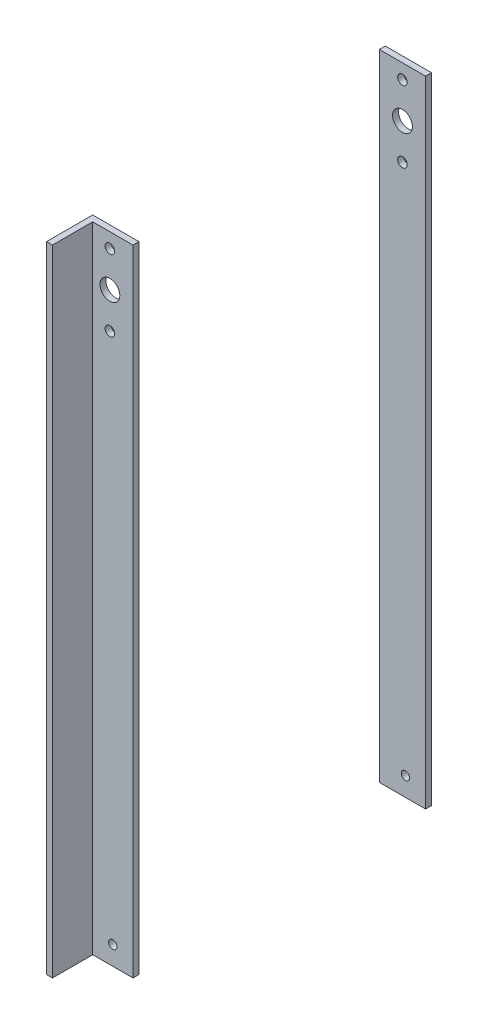
ISO-10303-21;
HEADER;
FILE_DESCRIPTION(('STEP AP214'),'2;1');
FILE_NAME('part.step','',(''),(''),'','','');
FILE_SCHEMA(('AUTOMOTIVE_DESIGN { 1 0 10303 214 1 1 1 1 }'));
ENDSEC;
DATA;
#1=APPLICATION_CONTEXT('core data for automotive mechanical design processes');
#2=APPLICATION_PROTOCOL_DEFINITION('international standard','automotive_design',2000,#1);
#3=PRODUCT_CONTEXT('',#1,'mechanical');
#4=PRODUCT('Part','Part','',(#3));
#5=PRODUCT_RELATED_PRODUCT_CATEGORY('part','',(#4));
#6=PRODUCT_DEFINITION_FORMATION('','',#4);
#7=PRODUCT_DEFINITION_CONTEXT('part definition',#1,'design');
#8=PRODUCT_DEFINITION('design','',#6,#7);
#9=PRODUCT_DEFINITION_SHAPE('','',#8);
#10=(LENGTH_UNIT() NAMED_UNIT(*) SI_UNIT(.MILLI.,.METRE.));
#11=(NAMED_UNIT(*) PLANE_ANGLE_UNIT() SI_UNIT($,.RADIAN.));
#12=(NAMED_UNIT(*) SI_UNIT($,.STERADIAN.) SOLID_ANGLE_UNIT());
#13=UNCERTAINTY_MEASURE_WITH_UNIT(LENGTH_MEASURE(1.E-05),#10,'distance_accuracy_value','');
#14=(GEOMETRIC_REPRESENTATION_CONTEXT(3) GLOBAL_UNCERTAINTY_ASSIGNED_CONTEXT((#13)) GLOBAL_UNIT_ASSIGNED_CONTEXT((#10,
#11,#12)) REPRESENTATION_CONTEXT('',''));
#15=CARTESIAN_POINT('',(0.,0.,0.));
#16=DIRECTION('',(0.,0.,1.));
#17=DIRECTION('',(1.,0.,0.));
#18=AXIS2_PLACEMENT_3D('',#15,#16,#17);
#19=CARTESIAN_POINT('',(0.,0.,159.15));
#20=DIRECTION('',(0.,0.,-1.));
#21=DIRECTION('',(-1.,0.,0.));
#22=AXIS2_PLACEMENT_3D('',#19,#20,#21);
#23=PLANE('',#22);
#24=CARTESIAN_POINT('',(13.15,-150.45,159.15));
#25=DIRECTION('',(0.,0.,1.));
#26=DIRECTION('',(1.,0.,0.));
#27=AXIS2_PLACEMENT_3D('',#24,#25,#26);
#28=CIRCLE('',#27,2.1);
#29=CARTESIAN_POINT('',(15.25,-150.45,159.15));
#30=VERTEX_POINT('',#29);
#31=EDGE_CURVE('E170',#30,#30,#28,.T.);
#32=ORIENTED_EDGE('',*,*,#31,.F.);
#33=EDGE_LOOP('',(#32));
#34=FACE_BOUND('',#33,.T.);
#35=CARTESIAN_POINT('',(11.65,152.6,159.15));
#36=DIRECTION('',(0.,0.,-1.));
#37=DIRECTION('',(-1.,0.,0.));
#38=AXIS2_PLACEMENT_3D('',#35,#36,#37);
#39=CIRCLE('',#38,2.39999999999999);
#40=CARTESIAN_POINT('',(9.25,152.6,159.15));
#41=VERTEX_POINT('',#40);
#42=EDGE_CURVE('E164',#41,#41,#39,.T.);
#43=ORIENTED_EDGE('',*,*,#42,.T.);
#44=EDGE_LOOP('',(#43));
#45=FACE_BOUND('',#44,.T.);
#46=CARTESIAN_POINT('',(11.65,116.6,159.15));
#47=DIRECTION('',(0.,0.,-1.));
#48=DIRECTION('',(-1.,0.,0.));
#49=AXIS2_PLACEMENT_3D('',#46,#47,#48);
#50=CIRCLE('',#49,2.4);
#51=CARTESIAN_POINT('',(9.25,116.6,159.15));
#52=VERTEX_POINT('',#51);
#53=EDGE_CURVE('E158',#52,#52,#50,.T.);
#54=ORIENTED_EDGE('',*,*,#53,.T.);
#55=EDGE_LOOP('',(#54));
#56=FACE_BOUND('',#55,.T.);
#57=CARTESIAN_POINT('',(11.65,134.6,159.15));
#58=DIRECTION('',(0.,0.,-1.));
#59=DIRECTION('',(-1.,0.,0.));
#60=AXIS2_PLACEMENT_3D('',#57,#58,#59);
#61=CIRCLE('',#60,5.00000000000001);
#62=CARTESIAN_POINT('',(6.64999999999999,134.6,159.15));
#63=VERTEX_POINT('',#62);
#64=EDGE_CURVE('E131',#63,#63,#61,.T.);
#65=ORIENTED_EDGE('',*,*,#64,.T.);
#66=EDGE_LOOP('',(#65));
#67=FACE_BOUND('',#66,.T.);
#68=DIRECTION('',(0.,1.,0.));
#69=VECTOR('',#68,1.);
#70=CARTESIAN_POINT('',(3.,160.,159.15));
#71=LINE('',#70,#69);
#72=CARTESIAN_POINT('',(3.00000000000002,-160.,159.15));
#73=VERTEX_POINT('',#72);
#74=CARTESIAN_POINT('',(3.,160.,159.15));
#75=VERTEX_POINT('',#74);
#76=EDGE_CURVE('E59',#73,#75,#71,.T.);
#77=ORIENTED_EDGE('',*,*,#76,.F.);
#78=DIRECTION('',(1.,0.,0.));
#79=VECTOR('',#78,1.);
#80=CARTESIAN_POINT('',(0.,-160.,159.15));
#81=LINE('',#80,#79);
#82=CARTESIAN_POINT('',(23.3,-160.,159.15));
#83=VERTEX_POINT('',#82);
#84=EDGE_CURVE('E64',#73,#83,#81,.T.);
#85=ORIENTED_EDGE('',*,*,#84,.T.);
#86=DIRECTION('',(0.,1.,0.));
#87=VECTOR('',#86,1.);
#88=CARTESIAN_POINT('',(23.3,-160.,159.15));
#89=LINE('',#88,#87);
#90=CARTESIAN_POINT('',(23.3,160.,159.15));
#91=VERTEX_POINT('',#90);
#92=EDGE_CURVE('E95',#83,#91,#89,.T.);
#93=ORIENTED_EDGE('',*,*,#92,.T.);
#94=DIRECTION('',(-1.,0.,0.));
#95=VECTOR('',#94,1.);
#96=CARTESIAN_POINT('',(0.,160.,159.15));
#97=LINE('',#96,#95);
#98=EDGE_CURVE('E119',#91,#75,#97,.T.);
#99=ORIENTED_EDGE('',*,*,#98,.T.);
#100=EDGE_LOOP('',(#77,#85,#93,#99));
#101=FACE_BOUND('',#100,.T.);
#102=ADVANCED_FACE('F42',(#34,#45,#56,#67,#101),#23,.F.);
#103=CARTESIAN_POINT('',(23.3,-160.,159.15));
#104=DIRECTION('',(-1.,0.,0.));
#105=DIRECTION('',(0.,0.,1.));
#106=AXIS2_PLACEMENT_3D('',#103,#104,#105);
#107=PLANE('',#106);
#108=DIRECTION('',(0.,1.,0.));
#109=VECTOR('',#108,1.);
#110=CARTESIAN_POINT('',(23.3,-160.,156.15));
#111=LINE('',#110,#109);
#112=CARTESIAN_POINT('',(23.3,-160.,156.15));
#113=VERTEX_POINT('',#112);
#114=CARTESIAN_POINT('',(23.3,160.,156.15));
#115=VERTEX_POINT('',#114);
#116=EDGE_CURVE('E101',#113,#115,#111,.T.);
#117=ORIENTED_EDGE('',*,*,#116,.T.);
#118=DIRECTION('',(0.,0.,-1.));
#119=VECTOR('',#118,1.);
#120=CARTESIAN_POINT('',(23.3,160.,159.15));
#121=LINE('',#120,#119);
#122=EDGE_CURVE('E12',#91,#115,#121,.T.);
#123=ORIENTED_EDGE('',*,*,#122,.F.);
#124=ORIENTED_EDGE('',*,*,#92,.F.);
#125=DIRECTION('',(0.,0.,-1.));
#126=VECTOR('',#125,1.);
#127=CARTESIAN_POINT('',(23.3,-160.,159.15));
#128=LINE('',#127,#126);
#129=EDGE_CURVE('E87',#83,#113,#128,.T.);
#130=ORIENTED_EDGE('',*,*,#129,.T.);
#131=EDGE_LOOP('',(#117,#123,#124,#130));
#132=FACE_BOUND('',#131,.T.);
#133=ADVANCED_FACE('F44',(#132),#107,.F.);
#134=CARTESIAN_POINT('',(0.,160.,159.15));
#135=DIRECTION('',(0.,-1.,0.));
#136=DIRECTION('',(0.,0.,-1.));
#137=AXIS2_PLACEMENT_3D('',#134,#135,#136);
#138=PLANE('',#137);
#139=DIRECTION('',(-1.,0.,0.));
#140=VECTOR('',#139,1.);
#141=CARTESIAN_POINT('',(0.,160.,156.15));
#142=LINE('',#141,#140);
#143=CARTESIAN_POINT('',(0.,160.,156.15));
#144=VERTEX_POINT('',#143);
#145=EDGE_CURVE('E104',#115,#144,#142,.T.);
#146=ORIENTED_EDGE('',*,*,#145,.T.);
#147=DIRECTION('',(0.,0.,-1.));
#148=VECTOR('',#147,1.);
#149=CARTESIAN_POINT('',(0.,160.,159.15));
#150=LINE('',#149,#148);
#151=CARTESIAN_POINT('',(0.,160.,179.45));
#152=VERTEX_POINT('',#151);
#153=EDGE_CURVE('E51',#152,#144,#150,.T.);
#154=ORIENTED_EDGE('',*,*,#153,.F.);
#155=DIRECTION('',(-1.,0.,0.));
#156=VECTOR('',#155,1.);
#157=CARTESIAN_POINT('',(0.,160.,179.45));
#158=LINE('',#157,#156);
#159=CARTESIAN_POINT('',(3.,160.,179.45));
#160=VERTEX_POINT('',#159);
#161=EDGE_CURVE('E127',#160,#152,#158,.T.);
#162=ORIENTED_EDGE('',*,*,#161,.F.);
#163=DIRECTION('',(0.,0.,-1.));
#164=VECTOR('',#163,1.);
#165=CARTESIAN_POINT('',(3.,160.,179.45));
#166=LINE('',#165,#164);
#167=EDGE_CURVE('E109',#160,#75,#166,.T.);
#168=ORIENTED_EDGE('',*,*,#167,.T.);
#169=ORIENTED_EDGE('',*,*,#98,.F.);
#170=ORIENTED_EDGE('',*,*,#122,.T.);
#171=EDGE_LOOP('',(#146,#154,#162,#168,#169,#170));
#172=FACE_BOUND('',#171,.T.);
#173=ADVANCED_FACE('F203',(#172),#138,.F.);
#174=CARTESIAN_POINT('',(0.,-160.,159.15));
#175=DIRECTION('',(1.,0.,0.));
#176=DIRECTION('',(0.,0.,-1.));
#177=AXIS2_PLACEMENT_3D('',#174,#175,#176);
#178=PLANE('',#177);
#179=DIRECTION('',(0.,-1.,0.));
#180=VECTOR('',#179,1.);
#181=CARTESIAN_POINT('',(0.,-160.,156.15));
#182=LINE('',#181,#180);
#183=CARTESIAN_POINT('',(0.,-160.,156.15));
#184=VERTEX_POINT('',#183);
#185=EDGE_CURVE('E96',#144,#184,#182,.T.);
#186=ORIENTED_EDGE('',*,*,#185,.T.);
#187=DIRECTION('',(0.,0.,-1.));
#188=VECTOR('',#187,1.);
#189=CARTESIAN_POINT('',(0.,-160.,159.15));
#190=LINE('',#189,#188);
#191=CARTESIAN_POINT('',(0.,-160.,179.45));
#192=VERTEX_POINT('',#191);
#193=EDGE_CURVE('E91',#192,#184,#190,.T.);
#194=ORIENTED_EDGE('',*,*,#193,.F.);
#195=DIRECTION('',(0.,-1.,0.));
#196=VECTOR('',#195,1.);
#197=CARTESIAN_POINT('',(0.,160.,179.45));
#198=LINE('',#197,#196);
#199=EDGE_CURVE('E130',#152,#192,#198,.T.);
#200=ORIENTED_EDGE('',*,*,#199,.F.);
#201=ORIENTED_EDGE('',*,*,#153,.T.);
#202=EDGE_LOOP('',(#186,#194,#200,#201));
#203=FACE_BOUND('',#202,.T.);
#204=ADVANCED_FACE('F210',(#203),#178,.F.);
#205=CARTESIAN_POINT('',(0.,-160.,159.15));
#206=DIRECTION('',(0.,1.,0.));
#207=DIRECTION('',(0.,0.,1.));
#208=AXIS2_PLACEMENT_3D('',#205,#206,#207);
#209=PLANE('',#208);
#210=DIRECTION('',(1.,0.,0.));
#211=VECTOR('',#210,1.);
#212=CARTESIAN_POINT('',(0.,-160.,156.15));
#213=LINE('',#212,#211);
#214=EDGE_CURVE('E84',#184,#113,#213,.T.);
#215=ORIENTED_EDGE('',*,*,#214,.T.);
#216=ORIENTED_EDGE('',*,*,#129,.F.);
#217=ORIENTED_EDGE('',*,*,#84,.F.);
#218=DIRECTION('',(0.,0.,-1.));
#219=VECTOR('',#218,1.);
#220=CARTESIAN_POINT('',(3.00000000000004,-160.,179.45));
#221=LINE('',#220,#219);
#222=CARTESIAN_POINT('',(3.00000000000004,-160.,179.45));
#223=VERTEX_POINT('',#222);
#224=EDGE_CURVE('E105',#223,#73,#221,.T.);
#225=ORIENTED_EDGE('',*,*,#224,.F.);
#226=DIRECTION('',(1.,0.,0.));
#227=VECTOR('',#226,1.);
#228=CARTESIAN_POINT('',(0.,-160.,179.45));
#229=LINE('',#228,#227);
#230=EDGE_CURVE('E146',#192,#223,#229,.T.);
#231=ORIENTED_EDGE('',*,*,#230,.F.);
#232=ORIENTED_EDGE('',*,*,#193,.T.);
#233=EDGE_LOOP('',(#215,#216,#217,#225,#231,#232));
#234=FACE_BOUND('',#233,.T.);
#235=ADVANCED_FACE('F86',(#234),#209,.F.);
#236=CARTESIAN_POINT('',(0.,0.,156.15));
#237=DIRECTION('',(0.,0.,-1.));
#238=DIRECTION('',(-1.,0.,0.));
#239=AXIS2_PLACEMENT_3D('',#236,#237,#238);
#240=PLANE('',#239);
#241=CARTESIAN_POINT('',(13.15,-150.45,156.15));
#242=DIRECTION('',(0.,0.,-1.));
#243=DIRECTION('',(-1.,0.,0.));
#244=AXIS2_PLACEMENT_3D('',#241,#242,#243);
#245=CIRCLE('',#244,2.1);
#246=CARTESIAN_POINT('',(11.05,-150.45,156.15));
#247=VERTEX_POINT('',#246);
#248=EDGE_CURVE('E46',#247,#247,#245,.T.);
#249=ORIENTED_EDGE('',*,*,#248,.F.);
#250=EDGE_LOOP('',(#249));
#251=FACE_BOUND('',#250,.T.);
#252=CARTESIAN_POINT('',(11.65,152.6,156.15));
#253=DIRECTION('',(0.,0.,-1.));
#254=DIRECTION('',(1.,0.,0.));
#255=AXIS2_PLACEMENT_3D('',#252,#253,#254);
#256=CIRCLE('',#255,2.39999999999999);
#257=CARTESIAN_POINT('',(14.05,152.6,156.15));
#258=VERTEX_POINT('',#257);
#259=EDGE_CURVE('E167',#258,#258,#256,.T.);
#260=ORIENTED_EDGE('',*,*,#259,.F.);
#261=EDGE_LOOP('',(#260));
#262=FACE_BOUND('',#261,.T.);
#263=CARTESIAN_POINT('',(11.65,116.6,156.15));
#264=DIRECTION('',(0.,0.,-1.));
#265=DIRECTION('',(-1.,0.,0.));
#266=AXIS2_PLACEMENT_3D('',#263,#264,#265);
#267=CIRCLE('',#266,2.4);
#268=CARTESIAN_POINT('',(9.25,116.6,156.15));
#269=VERTEX_POINT('',#268);
#270=EDGE_CURVE('E161',#269,#269,#267,.T.);
#271=ORIENTED_EDGE('',*,*,#270,.F.);
#272=EDGE_LOOP('',(#271));
#273=FACE_BOUND('',#272,.T.);
#274=CARTESIAN_POINT('',(11.65,134.6,156.15));
#275=DIRECTION('',(0.,0.,-1.));
#276=DIRECTION('',(-1.,0.,0.));
#277=AXIS2_PLACEMENT_3D('',#274,#275,#276);
#278=CIRCLE('',#277,5.00000000000001);
#279=CARTESIAN_POINT('',(6.64999999999999,134.6,156.15));
#280=VERTEX_POINT('',#279);
#281=EDGE_CURVE('E155',#280,#280,#278,.T.);
#282=ORIENTED_EDGE('',*,*,#281,.F.);
#283=EDGE_LOOP('',(#282));
#284=FACE_BOUND('',#283,.T.);
#285=ORIENTED_EDGE('',*,*,#116,.F.);
#286=ORIENTED_EDGE('',*,*,#214,.F.);
#287=ORIENTED_EDGE('',*,*,#185,.F.);
#288=ORIENTED_EDGE('',*,*,#145,.F.);
#289=EDGE_LOOP('',(#285,#286,#287,#288));
#290=FACE_BOUND('',#289,.T.);
#291=ADVANCED_FACE('F103',(#251,#262,#273,#284,#290),#240,.T.);
#292=CARTESIAN_POINT('',(3.,160.,179.45));
#293=DIRECTION('',(-1.,0.,0.));
#294=DIRECTION('',(0.,-1.,0.));
#295=AXIS2_PLACEMENT_3D('',#292,#293,#294);
#296=PLANE('',#295);
#297=ORIENTED_EDGE('',*,*,#76,.T.);
#298=ORIENTED_EDGE('',*,*,#167,.F.);
#299=DIRECTION('',(0.,1.,0.));
#300=VECTOR('',#299,1.);
#301=CARTESIAN_POINT('',(3.,160.,179.45));
#302=LINE('',#301,#300);
#303=EDGE_CURVE('E141',#223,#160,#302,.T.);
#304=ORIENTED_EDGE('',*,*,#303,.F.);
#305=ORIENTED_EDGE('',*,*,#224,.T.);
#306=EDGE_LOOP('',(#297,#298,#304,#305));
#307=FACE_BOUND('',#306,.T.);
#308=ADVANCED_FACE('F181',(#307),#296,.F.);
#309=CARTESIAN_POINT('',(0.,0.,179.45));
#310=DIRECTION('',(0.,0.,1.));
#311=DIRECTION('',(1.,0.,0.));
#312=AXIS2_PLACEMENT_3D('',#309,#310,#311);
#313=PLANE('',#312);
#314=ORIENTED_EDGE('',*,*,#199,.T.);
#315=ORIENTED_EDGE('',*,*,#230,.T.);
#316=ORIENTED_EDGE('',*,*,#303,.T.);
#317=ORIENTED_EDGE('',*,*,#161,.T.);
#318=EDGE_LOOP('',(#314,#315,#316,#317));
#319=FACE_BOUND('',#318,.T.);
#320=ADVANCED_FACE('F193',(#319),#313,.T.);
#321=CARTESIAN_POINT('',(11.65,134.6,176.45));
#322=DIRECTION('',(0.,0.,-1.));
#323=DIRECTION('',(-1.,0.,0.));
#324=AXIS2_PLACEMENT_3D('',#321,#322,#323);
#325=CYLINDRICAL_SURFACE('',#324,5.00000000000001);
#326=ORIENTED_EDGE('',*,*,#281,.T.);
#327=EDGE_LOOP('',(#326));
#328=FACE_BOUND('',#327,.T.);
#329=ORIENTED_EDGE('',*,*,#64,.F.);
#330=EDGE_LOOP('',(#329));
#331=FACE_BOUND('',#330,.T.);
#332=ADVANCED_FACE('F189',(#328,#331),#325,.F.);
#333=CARTESIAN_POINT('',(11.65,116.6,176.45));
#334=DIRECTION('',(0.,0.,-1.));
#335=DIRECTION('',(-1.,0.,0.));
#336=AXIS2_PLACEMENT_3D('',#333,#334,#335);
#337=CYLINDRICAL_SURFACE('',#336,2.4);
#338=ORIENTED_EDGE('',*,*,#270,.T.);
#339=EDGE_LOOP('',(#338));
#340=FACE_BOUND('',#339,.T.);
#341=ORIENTED_EDGE('',*,*,#53,.F.);
#342=EDGE_LOOP('',(#341));
#343=FACE_BOUND('',#342,.T.);
#344=ADVANCED_FACE('F192',(#340,#343),#337,.F.);
#345=CARTESIAN_POINT('',(11.65,152.6,176.45));
#346=DIRECTION('',(0.,0.,-1.));
#347=DIRECTION('',(-1.,0.,0.));
#348=AXIS2_PLACEMENT_3D('',#345,#346,#347);
#349=CYLINDRICAL_SURFACE('',#348,2.39999999999999);
#350=ORIENTED_EDGE('',*,*,#259,.T.);
#351=EDGE_LOOP('',(#350));
#352=FACE_BOUND('',#351,.T.);
#353=ORIENTED_EDGE('',*,*,#42,.F.);
#354=EDGE_LOOP('',(#353));
#355=FACE_BOUND('',#354,.T.);
#356=ADVANCED_FACE('F234',(#352,#355),#349,.F.);
#357=CARTESIAN_POINT('',(13.15,-150.45,8.15000000000002));
#358=DIRECTION('',(0.,0.,1.));
#359=DIRECTION('',(1.,0.,0.));
#360=AXIS2_PLACEMENT_3D('',#357,#358,#359);
#361=CYLINDRICAL_SURFACE('',#360,2.1);
#362=ORIENTED_EDGE('',*,*,#248,.T.);
#363=EDGE_LOOP('',(#362));
#364=FACE_BOUND('',#363,.T.);
#365=ORIENTED_EDGE('',*,*,#31,.T.);
#366=EDGE_LOOP('',(#365));
#367=FACE_BOUND('',#366,.T.);
#368=ADVANCED_FACE('F177',(#364,#367),#361,.F.);
#369=CLOSED_SHELL('',(#102,#133,#173,#204,#235,#291,#308,#320,#332,#344,#356,#368));
#370=MANIFOLD_SOLID_BREP('B2',#369);
#371=CARTESIAN_POINT('',(3.,160.,11.65));
#372=DIRECTION('',(0.,0.,-1.));
#373=DIRECTION('',(0.,1.,0.));
#374=AXIS2_PLACEMENT_3D('',#371,#372,#373);
#375=PLANE('',#374);
#376=CARTESIAN_POINT('',(13.15,-150.45,11.65));
#377=DIRECTION('',(0.,0.,-1.));
#378=DIRECTION('',(0.,1.,0.));
#379=AXIS2_PLACEMENT_3D('',#376,#377,#378);
#380=CIRCLE('',#379,2.1);
#381=CARTESIAN_POINT('',(13.15,-148.35,11.65));
#382=VERTEX_POINT('',#381);
#383=EDGE_CURVE('E444',#382,#382,#380,.T.);
#384=ORIENTED_EDGE('',*,*,#383,.T.);
#385=EDGE_LOOP('',(#384));
#386=FACE_BOUND('',#385,.T.);
#387=CARTESIAN_POINT('',(11.65,152.6,11.65));
#388=DIRECTION('',(0.,0.,-1.));
#389=DIRECTION('',(0.,1.,0.));
#390=AXIS2_PLACEMENT_3D('',#387,#388,#389);
#391=CIRCLE('',#390,2.4);
#392=CARTESIAN_POINT('',(11.65,155.,11.65));
#393=VERTEX_POINT('',#392);
#394=EDGE_CURVE('E452',#393,#393,#391,.F.);
#395=ORIENTED_EDGE('',*,*,#394,.F.);
#396=EDGE_LOOP('',(#395));
#397=FACE_BOUND('',#396,.T.);
#398=DIRECTION('',(0.,-1.,0.));
#399=VECTOR('',#398,1.);
#400=CARTESIAN_POINT('',(0.,160.,11.65));
#401=LINE('',#400,#399);
#402=CARTESIAN_POINT('',(0.,160.,11.65));
#403=VERTEX_POINT('',#402);
#404=CARTESIAN_POINT('',(0.,-160.,11.65));
#405=VERTEX_POINT('',#404);
#406=EDGE_CURVE('E425',#403,#405,#401,.T.);
#407=ORIENTED_EDGE('',*,*,#406,.T.);
#408=DIRECTION('',(-1.,0.,0.));
#409=VECTOR('',#408,1.);
#410=CARTESIAN_POINT('',(3.,-160.,11.65));
#411=LINE('',#410,#409);
#412=CARTESIAN_POINT('',(23.3,-160.,11.65));
#413=VERTEX_POINT('',#412);
#414=EDGE_CURVE('E431',#413,#405,#411,.T.);
#415=ORIENTED_EDGE('',*,*,#414,.F.);
#416=DIRECTION('',(0.,-1.,0.));
#417=VECTOR('',#416,1.);
#418=CARTESIAN_POINT('',(23.3,160.,11.65));
#419=LINE('',#418,#417);
#420=CARTESIAN_POINT('',(23.3,160.,11.65));
#421=VERTEX_POINT('',#420);
#422=EDGE_CURVE('E395',#421,#413,#419,.T.);
#423=ORIENTED_EDGE('',*,*,#422,.F.);
#424=DIRECTION('',(-1.,0.,0.));
#425=VECTOR('',#424,1.);
#426=CARTESIAN_POINT('',(3.,160.,11.65));
#427=LINE('',#426,#425);
#428=EDGE_CURVE('E433',#421,#403,#427,.T.);
#429=ORIENTED_EDGE('',*,*,#428,.T.);
#430=EDGE_LOOP('',(#407,#415,#423,#429));
#431=FACE_BOUND('',#430,.T.);
#432=CARTESIAN_POINT('',(11.65,134.6,11.65));
#433=DIRECTION('',(0.,0.,-1.));
#434=DIRECTION('',(0.,1.,0.));
#435=AXIS2_PLACEMENT_3D('',#432,#433,#434);
#436=CIRCLE('',#435,5.);
#437=CARTESIAN_POINT('',(11.65,139.6,11.65));
#438=VERTEX_POINT('',#437);
#439=EDGE_CURVE('E396',#438,#438,#436,.F.);
#440=ORIENTED_EDGE('',*,*,#439,.F.);
#441=EDGE_LOOP('',(#440));
#442=FACE_BOUND('',#441,.T.);
#443=CARTESIAN_POINT('',(11.65,116.6,11.65));
#444=DIRECTION('',(0.,0.,-1.));
#445=DIRECTION('',(0.,1.,0.));
#446=AXIS2_PLACEMENT_3D('',#443,#444,#445);
#447=CIRCLE('',#446,2.4);
#448=CARTESIAN_POINT('',(11.65,119.,11.65));
#449=VERTEX_POINT('',#448);
#450=EDGE_CURVE('E448',#449,#449,#447,.F.);
#451=ORIENTED_EDGE('',*,*,#450,.F.);
#452=EDGE_LOOP('',(#451));
#453=FACE_BOUND('',#452,.T.);
#454=ADVANCED_FACE('F320',(#386,#397,#431,#442,#453),#375,.F.);
#455=CARTESIAN_POINT('',(23.3,160.,8.65000000000002));
#456=DIRECTION('',(0.,0.,1.));
#457=DIRECTION('',(0.,-1.,0.));
#458=AXIS2_PLACEMENT_3D('',#455,#456,#457);
#459=PLANE('',#458);
#460=CARTESIAN_POINT('',(13.15,-150.45,8.64999999999998));
#461=DIRECTION('',(0.,0.,1.));
#462=DIRECTION('',(0.,-1.,0.));
#463=AXIS2_PLACEMENT_3D('',#460,#461,#462);
#464=CIRCLE('',#463,2.1);
#465=CARTESIAN_POINT('',(13.15,-152.55,8.64999999999998));
#466=VERTEX_POINT('',#465);
#467=EDGE_CURVE('E441',#466,#466,#464,.T.);
#468=ORIENTED_EDGE('',*,*,#467,.T.);
#469=EDGE_LOOP('',(#468));
#470=FACE_BOUND('',#469,.T.);
#471=CARTESIAN_POINT('',(11.65,152.6,8.65000000000003));
#472=DIRECTION('',(0.,0.,1.));
#473=DIRECTION('',(0.,-1.,0.));
#474=AXIS2_PLACEMENT_3D('',#471,#472,#473);
#475=CIRCLE('',#474,2.4);
#476=CARTESIAN_POINT('',(11.65,150.2,8.65000000000003));
#477=VERTEX_POINT('',#476);
#478=EDGE_CURVE('E449',#477,#477,#475,.F.);
#479=ORIENTED_EDGE('',*,*,#478,.F.);
#480=EDGE_LOOP('',(#479));
#481=FACE_BOUND('',#480,.T.);
#482=DIRECTION('',(0.,1.,0.));
#483=VECTOR('',#482,1.);
#484=CARTESIAN_POINT('',(3.,160.,8.65000000000002));
#485=LINE('',#484,#483);
#486=CARTESIAN_POINT('',(3.,-160.,8.65));
#487=VERTEX_POINT('',#486);
#488=CARTESIAN_POINT('',(3.,108.,8.65000000000001));
#489=VERTEX_POINT('',#488);
#490=EDGE_CURVE('E343',#487,#489,#485,.T.);
#491=ORIENTED_EDGE('',*,*,#490,.T.);
#492=DIRECTION('',(1.,0.,0.));
#493=VECTOR('',#492,1.);
#494=CARTESIAN_POINT('',(-148.,108.,8.65000000000001));
#495=LINE('',#494,#493);
#496=CARTESIAN_POINT('',(0.,108.,8.65000000000001));
#497=VERTEX_POINT('',#496);
#498=EDGE_CURVE('E378',#497,#489,#495,.T.);
#499=ORIENTED_EDGE('',*,*,#498,.F.);
#500=DIRECTION('',(0.,-1.,0.));
#501=VECTOR('',#500,1.);
#502=CARTESIAN_POINT('',(0.,0.,8.65));
#503=LINE('',#502,#501);
#504=CARTESIAN_POINT('',(0.,160.,8.65000000000002));
#505=VERTEX_POINT('',#504);
#506=EDGE_CURVE('E40',#505,#497,#503,.T.);
#507=ORIENTED_EDGE('',*,*,#506,.F.);
#508=DIRECTION('',(-1.,0.,0.));
#509=VECTOR('',#508,1.);
#510=CARTESIAN_POINT('',(23.3,160.,8.65000000000002));
#511=LINE('',#510,#509);
#512=CARTESIAN_POINT('',(23.3,160.,8.65000000000002));
#513=VERTEX_POINT('',#512);
#514=EDGE_CURVE('E410',#513,#505,#511,.T.);
#515=ORIENTED_EDGE('',*,*,#514,.F.);
#516=DIRECTION('',(0.,1.,0.));
#517=VECTOR('',#516,1.);
#518=CARTESIAN_POINT('',(23.3,160.,8.65000000000002));
#519=LINE('',#518,#517);
#520=CARTESIAN_POINT('',(23.3,-160.,8.64999999999998));
#521=VERTEX_POINT('',#520);
#522=EDGE_CURVE('E462',#521,#513,#519,.T.);
#523=ORIENTED_EDGE('',*,*,#522,.F.);
#524=DIRECTION('',(-1.,0.,0.));
#525=VECTOR('',#524,1.);
#526=CARTESIAN_POINT('',(23.3,-160.,8.64999999999998));
#527=LINE('',#526,#525);
#528=EDGE_CURVE('E394',#521,#487,#527,.T.);
#529=ORIENTED_EDGE('',*,*,#528,.T.);
#530=EDGE_LOOP('',(#491,#499,#507,#515,#523,#529));
#531=FACE_BOUND('',#530,.T.);
#532=CARTESIAN_POINT('',(11.65,134.6,8.65000000000003));
#533=DIRECTION('',(0.,0.,1.));
#534=DIRECTION('',(0.,-1.,0.));
#535=AXIS2_PLACEMENT_3D('',#532,#533,#534);
#536=CIRCLE('',#535,5.);
#537=CARTESIAN_POINT('',(11.65,129.6,8.65000000000003));
#538=VERTEX_POINT('',#537);
#539=EDGE_CURVE('E402',#538,#538,#536,.F.);
#540=ORIENTED_EDGE('',*,*,#539,.F.);
#541=EDGE_LOOP('',(#540));
#542=FACE_BOUND('',#541,.T.);
#543=CARTESIAN_POINT('',(11.65,116.6,8.65000000000002));
#544=DIRECTION('',(0.,0.,1.));
#545=DIRECTION('',(0.,-1.,0.));
#546=AXIS2_PLACEMENT_3D('',#543,#544,#545);
#547=CIRCLE('',#546,2.4);
#548=CARTESIAN_POINT('',(11.65,114.2,8.65000000000002));
#549=VERTEX_POINT('',#548);
#550=EDGE_CURVE('E445',#549,#549,#547,.F.);
#551=ORIENTED_EDGE('',*,*,#550,.F.);
#552=EDGE_LOOP('',(#551));
#553=FACE_BOUND('',#552,.T.);
#554=ADVANCED_FACE('F390',(#470,#481,#531,#542,#553),#459,.F.);
#555=CARTESIAN_POINT('',(3.,160.,-11.65));
#556=DIRECTION('',(0.,0.,1.));
#557=DIRECTION('',(0.,-1.,0.));
#558=AXIS2_PLACEMENT_3D('',#555,#556,#557);
#559=PLANE('',#558);
#560=DIRECTION('',(0.,1.,0.));
#561=VECTOR('',#560,1.);
#562=CARTESIAN_POINT('',(0.,160.,-11.65));
#563=LINE('',#562,#561);
#564=CARTESIAN_POINT('',(0.,-160.,-11.65));
#565=VERTEX_POINT('',#564);
#566=CARTESIAN_POINT('',(0.,108.,-11.65));
#567=VERTEX_POINT('',#566);
#568=EDGE_CURVE('E420',#565,#567,#563,.T.);
#569=ORIENTED_EDGE('',*,*,#568,.T.);
#570=DIRECTION('',(1.,0.,0.));
#571=VECTOR('',#570,1.);
#572=CARTESIAN_POINT('',(-148.,108.,-11.65));
#573=LINE('',#572,#571);
#574=CARTESIAN_POINT('',(3.,108.,-11.65));
#575=VERTEX_POINT('',#574);
#576=EDGE_CURVE('E335',#567,#575,#573,.T.);
#577=ORIENTED_EDGE('',*,*,#576,.T.);
#578=DIRECTION('',(0.,1.,0.));
#579=VECTOR('',#578,1.);
#580=CARTESIAN_POINT('',(3.,160.,-11.65));
#581=LINE('',#580,#579);
#582=CARTESIAN_POINT('',(3.,-160.,-11.65));
#583=VERTEX_POINT('',#582);
#584=EDGE_CURVE('E387',#583,#575,#581,.T.);
#585=ORIENTED_EDGE('',*,*,#584,.F.);
#586=DIRECTION('',(-1.,0.,0.));
#587=VECTOR('',#586,1.);
#588=CARTESIAN_POINT('',(3.,-160.,-11.65));
#589=LINE('',#588,#587);
#590=EDGE_CURVE('E428',#583,#565,#589,.T.);
#591=ORIENTED_EDGE('',*,*,#590,.T.);
#592=EDGE_LOOP('',(#569,#577,#585,#591));
#593=FACE_BOUND('',#592,.T.);
#594=ADVANCED_FACE('F322',(#593),#559,.F.);
#595=CARTESIAN_POINT('',(3.,160.,11.65));
#596=DIRECTION('',(0.,-1.,0.));
#597=DIRECTION('',(0.,0.,-1.));
#598=AXIS2_PLACEMENT_3D('',#595,#596,#597);
#599=PLANE('',#598);
#600=ORIENTED_EDGE('',*,*,#514,.T.);
#601=DIRECTION('',(0.,0.,1.));
#602=VECTOR('',#601,1.);
#603=CARTESIAN_POINT('',(0.,160.,11.65));
#604=LINE('',#603,#602);
#605=EDGE_CURVE('E423',#505,#403,#604,.T.);
#606=ORIENTED_EDGE('',*,*,#605,.T.);
#607=ORIENTED_EDGE('',*,*,#428,.F.);
#608=DIRECTION('',(0.,0.,1.));
#609=VECTOR('',#608,1.);
#610=CARTESIAN_POINT('',(23.3,160.,11.65));
#611=LINE('',#610,#609);
#612=EDGE_CURVE('E415',#513,#421,#611,.T.);
#613=ORIENTED_EDGE('',*,*,#612,.F.);
#614=EDGE_LOOP('',(#600,#606,#607,#613));
#615=FACE_BOUND('',#614,.T.);
#616=ADVANCED_FACE('F482',(#615),#599,.F.);
#617=CARTESIAN_POINT('',(3.,-160.,11.65));
#618=DIRECTION('',(0.,1.,0.));
#619=DIRECTION('',(0.,0.,1.));
#620=AXIS2_PLACEMENT_3D('',#617,#618,#619);
#621=PLANE('',#620);
#622=DIRECTION('',(0.,0.,-1.));
#623=VECTOR('',#622,1.);
#624=CARTESIAN_POINT('',(0.,-160.,11.65));
#625=LINE('',#624,#623);
#626=EDGE_CURVE('E417',#405,#565,#625,.T.);
#627=ORIENTED_EDGE('',*,*,#626,.T.);
#628=ORIENTED_EDGE('',*,*,#590,.F.);
#629=DIRECTION('',(0.,0.,-1.));
#630=VECTOR('',#629,1.);
#631=CARTESIAN_POINT('',(3.,-160.,11.65));
#632=LINE('',#631,#630);
#633=EDGE_CURVE('E407',#487,#583,#632,.T.);
#634=ORIENTED_EDGE('',*,*,#633,.F.);
#635=ORIENTED_EDGE('',*,*,#528,.F.);
#636=DIRECTION('',(0.,0.,-1.));
#637=VECTOR('',#636,1.);
#638=CARTESIAN_POINT('',(23.3,-160.,11.65));
#639=LINE('',#638,#637);
#640=EDGE_CURVE('E399',#413,#521,#639,.T.);
#641=ORIENTED_EDGE('',*,*,#640,.F.);
#642=ORIENTED_EDGE('',*,*,#414,.T.);
#643=EDGE_LOOP('',(#627,#628,#634,#635,#641,#642));
#644=FACE_BOUND('',#643,.T.);
#645=ADVANCED_FACE('F478',(#644),#621,.F.);
#646=CARTESIAN_POINT('',(3.,0.,0.));
#647=DIRECTION('',(1.,0.,0.));
#648=DIRECTION('',(0.,0.,-1.));
#649=AXIS2_PLACEMENT_3D('',#646,#647,#648);
#650=PLANE('',#649);
#651=DIRECTION('',(0.,0.,-1.));
#652=VECTOR('',#651,1.);
#653=CARTESIAN_POINT('',(3.,108.,8.65000000000001));
#654=LINE('',#653,#652);
#655=EDGE_CURVE('E380',#489,#575,#654,.T.);
#656=ORIENTED_EDGE('',*,*,#655,.F.);
#657=ORIENTED_EDGE('',*,*,#490,.F.);
#658=ORIENTED_EDGE('',*,*,#633,.T.);
#659=ORIENTED_EDGE('',*,*,#584,.T.);
#660=EDGE_LOOP('',(#656,#657,#658,#659));
#661=FACE_BOUND('',#660,.T.);
#662=ADVANCED_FACE('F385',(#661),#650,.T.);
#663=CARTESIAN_POINT('',(0.,0.,0.));
#664=DIRECTION('',(1.,0.,0.));
#665=DIRECTION('',(0.,0.,-1.));
#666=AXIS2_PLACEMENT_3D('',#663,#664,#665);
#667=PLANE('',#666);
#668=ORIENTED_EDGE('',*,*,#605,.F.);
#669=ORIENTED_EDGE('',*,*,#506,.T.);
#670=DIRECTION('',(0.,0.,-1.));
#671=VECTOR('',#670,1.);
#672=CARTESIAN_POINT('',(0.,108.,0.));
#673=LINE('',#672,#671);
#674=EDGE_CURVE('E328',#497,#567,#673,.T.);
#675=ORIENTED_EDGE('',*,*,#674,.T.);
#676=ORIENTED_EDGE('',*,*,#568,.F.);
#677=ORIENTED_EDGE('',*,*,#626,.F.);
#678=ORIENTED_EDGE('',*,*,#406,.F.);
#679=EDGE_LOOP('',(#668,#669,#675,#676,#677,#678));
#680=FACE_BOUND('',#679,.T.);
#681=ADVANCED_FACE('F476',(#680),#667,.F.);
#682=CARTESIAN_POINT('',(23.3,0.,0.));
#683=DIRECTION('',(1.,0.,0.));
#684=DIRECTION('',(0.,0.,-1.));
#685=AXIS2_PLACEMENT_3D('',#682,#683,#684);
#686=PLANE('',#685);
#687=ORIENTED_EDGE('',*,*,#422,.T.);
#688=ORIENTED_EDGE('',*,*,#640,.T.);
#689=ORIENTED_EDGE('',*,*,#522,.T.);
#690=ORIENTED_EDGE('',*,*,#612,.T.);
#691=EDGE_LOOP('',(#687,#688,#689,#690));
#692=FACE_BOUND('',#691,.T.);
#693=ADVANCED_FACE('F481',(#692),#686,.T.);
#694=CARTESIAN_POINT('',(11.65,134.6,45.9499999999999));
#695=DIRECTION('',(0.,0.,-1.));
#696=DIRECTION('',(-1.,0.,0.));
#697=AXIS2_PLACEMENT_3D('',#694,#695,#696);
#698=CYLINDRICAL_SURFACE('',#697,5.);
#699=ORIENTED_EDGE('',*,*,#539,.T.);
#700=EDGE_LOOP('',(#699));
#701=FACE_BOUND('',#700,.T.);
#702=ORIENTED_EDGE('',*,*,#439,.T.);
#703=EDGE_LOOP('',(#702));
#704=FACE_BOUND('',#703,.T.);
#705=ADVANCED_FACE('F505',(#701,#704),#698,.F.);
#706=CARTESIAN_POINT('',(11.65,152.6,45.9499999999999));
#707=DIRECTION('',(0.,0.,-1.));
#708=DIRECTION('',(-1.,0.,0.));
#709=AXIS2_PLACEMENT_3D('',#706,#707,#708);
#710=CYLINDRICAL_SURFACE('',#709,2.4);
#711=ORIENTED_EDGE('',*,*,#478,.T.);
#712=EDGE_LOOP('',(#711));
#713=FACE_BOUND('',#712,.T.);
#714=ORIENTED_EDGE('',*,*,#394,.T.);
#715=EDGE_LOOP('',(#714));
#716=FACE_BOUND('',#715,.T.);
#717=ADVANCED_FACE('F508',(#713,#716),#710,.F.);
#718=CARTESIAN_POINT('',(11.65,116.6,45.9499999999999));
#719=DIRECTION('',(0.,0.,-1.));
#720=DIRECTION('',(-1.,0.,0.));
#721=AXIS2_PLACEMENT_3D('',#718,#719,#720);
#722=CYLINDRICAL_SURFACE('',#721,2.4);
#723=ORIENTED_EDGE('',*,*,#550,.T.);
#724=EDGE_LOOP('',(#723));
#725=FACE_BOUND('',#724,.T.);
#726=ORIENTED_EDGE('',*,*,#450,.T.);
#727=EDGE_LOOP('',(#726));
#728=FACE_BOUND('',#727,.T.);
#729=ADVANCED_FACE('F512',(#725,#728),#722,.F.);
#730=CARTESIAN_POINT('',(13.15,-150.45,8.15000000000002));
#731=DIRECTION('',(0.,0.,1.));
#732=DIRECTION('',(1.,0.,0.));
#733=AXIS2_PLACEMENT_3D('',#730,#731,#732);
#734=CYLINDRICAL_SURFACE('',#733,2.1);
#735=ORIENTED_EDGE('',*,*,#467,.F.);
#736=EDGE_LOOP('',(#735));
#737=FACE_BOUND('',#736,.T.);
#738=ORIENTED_EDGE('',*,*,#383,.F.);
#739=EDGE_LOOP('',(#738));
#740=FACE_BOUND('',#739,.T.);
#741=ADVANCED_FACE('F516',(#737,#740),#734,.F.);
#742=CARTESIAN_POINT('',(-148.,108.,8.65000000000001));
#743=DIRECTION('',(0.,-1.,0.));
#744=DIRECTION('',(0.,0.,-1.));
#745=AXIS2_PLACEMENT_3D('',#742,#743,#744);
#746=PLANE('',#745);
#747=ORIENTED_EDGE('',*,*,#498,.T.);
#748=ORIENTED_EDGE('',*,*,#655,.T.);
#749=ORIENTED_EDGE('',*,*,#576,.F.);
#750=ORIENTED_EDGE('',*,*,#674,.F.);
#751=EDGE_LOOP('',(#747,#748,#749,#750));
#752=FACE_BOUND('',#751,.T.);
#753=ADVANCED_FACE('F379',(#752),#746,.F.);
#754=CLOSED_SHELL('',(#454,#554,#594,#616,#645,#662,#681,#693,#705,#717,#729,#741,#753));
#755=MANIFOLD_SOLID_BREP('B6',#754);
#756=ADVANCED_BREP_SHAPE_REPRESENTATION('',(#18,#370,#755),#14);
#757=SHAPE_DEFINITION_REPRESENTATION(#9,#756);
ENDSEC;
END-ISO-10303-21;
